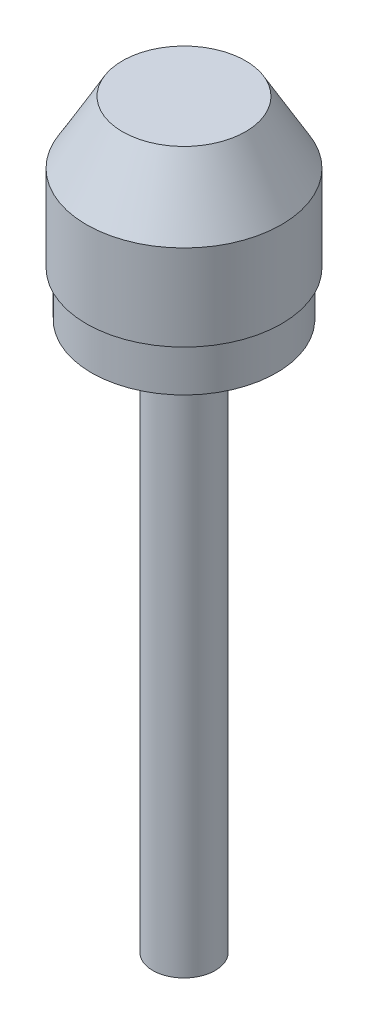
ISO-10303-21;
HEADER;
FILE_DESCRIPTION(('STEP AP214'),'2;1');
FILE_NAME('part.step','',(''),(''),'','','');
FILE_SCHEMA(('AUTOMOTIVE_DESIGN { 1 0 10303 214 1 1 1 1 }'));
ENDSEC;
DATA;
#1=APPLICATION_CONTEXT('core data for automotive mechanical design processes');
#2=APPLICATION_PROTOCOL_DEFINITION('international standard','automotive_design',2000,#1);
#3=PRODUCT_CONTEXT('',#1,'mechanical');
#4=PRODUCT('Part','Part','',(#3));
#5=PRODUCT_RELATED_PRODUCT_CATEGORY('part','',(#4));
#6=PRODUCT_DEFINITION_FORMATION('','',#4);
#7=PRODUCT_DEFINITION_CONTEXT('part definition',#1,'design');
#8=PRODUCT_DEFINITION('design','',#6,#7);
#9=PRODUCT_DEFINITION_SHAPE('','',#8);
#10=(LENGTH_UNIT() NAMED_UNIT(*) SI_UNIT(.MILLI.,.METRE.));
#11=(NAMED_UNIT(*) PLANE_ANGLE_UNIT() SI_UNIT($,.RADIAN.));
#12=(NAMED_UNIT(*) SI_UNIT($,.STERADIAN.) SOLID_ANGLE_UNIT());
#13=UNCERTAINTY_MEASURE_WITH_UNIT(LENGTH_MEASURE(1.E-05),#10,'distance_accuracy_value','');
#14=(GEOMETRIC_REPRESENTATION_CONTEXT(3) GLOBAL_UNCERTAINTY_ASSIGNED_CONTEXT((#13)) GLOBAL_UNIT_ASSIGNED_CONTEXT((#10,
#11,#12)) REPRESENTATION_CONTEXT('',''));
#15=CARTESIAN_POINT('',(0.,0.,0.));
#16=DIRECTION('',(0.,0.,1.));
#17=DIRECTION('',(1.,0.,0.));
#18=AXIS2_PLACEMENT_3D('',#15,#16,#17);
#19=CARTESIAN_POINT('',(0.,35.,0.));
#20=DIRECTION('',(0.,-1.,0.));
#21=DIRECTION('',(0.,0.,-1.));
#22=AXIS2_PLACEMENT_3D('',#19,#20,#21);
#23=CYLINDRICAL_SURFACE('',#22,2.);
#24=CARTESIAN_POINT('',(0.,35.,0.));
#25=DIRECTION('',(0.,1.,0.));
#26=DIRECTION('',(0.,0.,1.));
#27=AXIS2_PLACEMENT_3D('',#24,#25,#26);
#28=CIRCLE('',#27,2.);
#29=CARTESIAN_POINT('',(0.,35.,2.));
#30=VERTEX_POINT('',#29);
#31=EDGE_CURVE('E55',#30,#30,#28,.T.);
#32=ORIENTED_EDGE('',*,*,#31,.F.);
#33=EDGE_LOOP('',(#32));
#34=FACE_BOUND('',#33,.T.);
#35=CARTESIAN_POINT('',(0.,0.,0.));
#36=DIRECTION('',(0.,1.,0.));
#37=DIRECTION('',(0.,0.,1.));
#38=AXIS2_PLACEMENT_3D('',#35,#36,#37);
#39=CIRCLE('',#38,2.);
#40=CARTESIAN_POINT('',(0.,0.,2.));
#41=VERTEX_POINT('',#40);
#42=EDGE_CURVE('E56',#41,#41,#39,.T.);
#43=ORIENTED_EDGE('',*,*,#42,.T.);
#44=EDGE_LOOP('',(#43));
#45=FACE_BOUND('',#44,.T.);
#46=ADVANCED_FACE('F35',(#34,#45),#23,.T.);
#47=CARTESIAN_POINT('',(0.,0.,0.));
#48=DIRECTION('',(0.,1.,0.));
#49=DIRECTION('',(0.,0.,1.));
#50=AXIS2_PLACEMENT_3D('',#47,#48,#49);
#51=PLANE('',#50);
#52=ORIENTED_EDGE('',*,*,#42,.F.);
#53=EDGE_LOOP('',(#52));
#54=FACE_BOUND('',#53,.T.);
#55=ADVANCED_FACE('F85',(#54),#51,.F.);
#56=CARTESIAN_POINT('',(0.,38.,0.));
#57=DIRECTION('',(0.,-1.,0.));
#58=DIRECTION('',(0.,0.,-1.));
#59=AXIS2_PLACEMENT_3D('',#56,#57,#58);
#60=CYLINDRICAL_SURFACE('',#59,5.925);
#61=CARTESIAN_POINT('',(0.,35.1154700538379,0.));
#62=DIRECTION('',(0.,1.,0.));
#63=DIRECTION('',(0.,0.,1.));
#64=AXIS2_PLACEMENT_3D('',#61,#62,#63);
#65=CIRCLE('',#64,5.925);
#66=CARTESIAN_POINT('',(0.,35.1154700538379,5.925));
#67=VERTEX_POINT('',#66);
#68=EDGE_CURVE('E42',#67,#67,#65,.T.);
#69=ORIENTED_EDGE('',*,*,#68,.T.);
#70=EDGE_LOOP('',(#69));
#71=FACE_BOUND('',#70,.T.);
#72=CARTESIAN_POINT('',(0.,38.,0.));
#73=DIRECTION('',(0.,1.,0.));
#74=DIRECTION('',(0.,0.,1.));
#75=AXIS2_PLACEMENT_3D('',#72,#73,#74);
#76=CIRCLE('',#75,5.925);
#77=CARTESIAN_POINT('',(0.,38.,5.925));
#78=VERTEX_POINT('',#77);
#79=EDGE_CURVE('E59',#78,#78,#76,.T.);
#80=ORIENTED_EDGE('',*,*,#79,.F.);
#81=EDGE_LOOP('',(#80));
#82=FACE_BOUND('',#81,.T.);
#83=ADVANCED_FACE('F91',(#71,#82),#60,.T.);
#84=CARTESIAN_POINT('',(0.,35.,0.));
#85=DIRECTION('',(0.,1.,0.));
#86=DIRECTION('',(0.,0.,1.));
#87=AXIS2_PLACEMENT_3D('',#84,#85,#86);
#88=PLANE('',#87);
#89=CARTESIAN_POINT('',(0.,35.,0.));
#90=DIRECTION('',(0.,1.,0.));
#91=DIRECTION('',(0.,0.,1.));
#92=AXIS2_PLACEMENT_3D('',#89,#90,#91);
#93=CIRCLE('',#92,5.725);
#94=CARTESIAN_POINT('',(0.,35.,5.725));
#95=VERTEX_POINT('',#94);
#96=EDGE_CURVE('E10',#95,#95,#93,.F.);
#97=ORIENTED_EDGE('',*,*,#96,.T.);
#98=EDGE_LOOP('',(#97));
#99=FACE_BOUND('',#98,.T.);
#100=ORIENTED_EDGE('',*,*,#31,.T.);
#101=EDGE_LOOP('',(#100));
#102=FACE_BOUND('',#101,.T.);
#103=ADVANCED_FACE('F99',(#99,#102),#88,.F.);
#104=CARTESIAN_POINT('',(0.,47.5,0.));
#105=DIRECTION('',(0.,-1.,0.));
#106=DIRECTION('',(0.,0.,-1.));
#107=AXIS2_PLACEMENT_3D('',#104,#105,#106);
#108=CYLINDRICAL_SURFACE('',#107,6.25);
#109=CARTESIAN_POINT('',(0.,43.5,0.));
#110=DIRECTION('',(0.,1.,0.));
#111=DIRECTION('',(0.,0.,1.));
#112=AXIS2_PLACEMENT_3D('',#109,#110,#111);
#113=CIRCLE('',#112,6.25);
#114=CARTESIAN_POINT('',(0.,43.5,6.25));
#115=VERTEX_POINT('',#114);
#116=EDGE_CURVE('E46',#115,#115,#113,.F.);
#117=ORIENTED_EDGE('',*,*,#116,.T.);
#118=EDGE_LOOP('',(#117));
#119=FACE_BOUND('',#118,.T.);
#120=CARTESIAN_POINT('',(0.,38.,0.));
#121=DIRECTION('',(0.,1.,0.));
#122=DIRECTION('',(0.,0.,1.));
#123=AXIS2_PLACEMENT_3D('',#120,#121,#122);
#124=CIRCLE('',#123,6.25);
#125=CARTESIAN_POINT('',(0.,38.,6.25));
#126=VERTEX_POINT('',#125);
#127=EDGE_CURVE('E64',#126,#126,#124,.T.);
#128=ORIENTED_EDGE('',*,*,#127,.T.);
#129=EDGE_LOOP('',(#128));
#130=FACE_BOUND('',#129,.T.);
#131=ADVANCED_FACE('F68',(#119,#130),#108,.T.);
#132=CARTESIAN_POINT('',(0.,47.5,0.));
#133=DIRECTION('',(0.,1.,0.));
#134=DIRECTION('',(0.,0.,1.));
#135=AXIS2_PLACEMENT_3D('',#132,#133,#134);
#136=PLANE('',#135);
#137=CARTESIAN_POINT('',(0.,47.5,0.));
#138=DIRECTION('',(0.,1.,0.));
#139=DIRECTION('',(0.,0.,1.));
#140=AXIS2_PLACEMENT_3D('',#137,#138,#139);
#141=CIRCLE('',#140,3.94059892324149);
#142=CARTESIAN_POINT('',(0.,47.5,3.94059892324149));
#143=VERTEX_POINT('',#142);
#144=EDGE_CURVE('E50',#143,#143,#141,.T.);
#145=ORIENTED_EDGE('',*,*,#144,.T.);
#146=EDGE_LOOP('',(#145));
#147=FACE_BOUND('',#146,.T.);
#148=ADVANCED_FACE('F73',(#147),#136,.T.);
#149=CARTESIAN_POINT('',(0.,38.,0.));
#150=DIRECTION('',(0.,1.,0.));
#151=DIRECTION('',(0.,0.,1.));
#152=AXIS2_PLACEMENT_3D('',#149,#150,#151);
#153=PLANE('',#152);
#154=ORIENTED_EDGE('',*,*,#79,.T.);
#155=EDGE_LOOP('',(#154));
#156=FACE_BOUND('',#155,.T.);
#157=ORIENTED_EDGE('',*,*,#127,.F.);
#158=EDGE_LOOP('',(#157));
#159=FACE_BOUND('',#158,.T.);
#160=ADVANCED_FACE('F70',(#156,#159),#153,.F.);
#161=CARTESIAN_POINT('',(0.,47.5,0.));
#162=DIRECTION('',(0.,-1.,0.));
#163=DIRECTION('',(0.,0.,-1.));
#164=AXIS2_PLACEMENT_3D('',#161,#162,#163);
#165=CONICAL_SURFACE('',#164,3.94059892324149,0.523598775598296);
#166=ORIENTED_EDGE('',*,*,#116,.F.);
#167=EDGE_LOOP('',(#166));
#168=FACE_BOUND('',#167,.T.);
#169=ORIENTED_EDGE('',*,*,#144,.F.);
#170=EDGE_LOOP('',(#169));
#171=FACE_BOUND('',#170,.T.);
#172=ADVANCED_FACE('F72',(#168,#171),#165,.T.);
#173=CARTESIAN_POINT('',(0.,35.1154700538379,0.));
#174=DIRECTION('',(0.,1.,0.));
#175=DIRECTION('',(0.,0.,1.));
#176=AXIS2_PLACEMENT_3D('',#173,#174,#175);
#177=CONICAL_SURFACE('',#176,5.925,1.04719755119659);
#178=ORIENTED_EDGE('',*,*,#96,.F.);
#179=EDGE_LOOP('',(#178));
#180=FACE_BOUND('',#179,.T.);
#181=ORIENTED_EDGE('',*,*,#68,.F.);
#182=EDGE_LOOP('',(#181));
#183=FACE_BOUND('',#182,.T.);
#184=ADVANCED_FACE('F37',(#180,#183),#177,.T.);
#185=CLOSED_SHELL('',(#46,#55,#83,#103,#131,#148,#160,#172,#184));
#186=MANIFOLD_SOLID_BREP('B2',#185);
#187=ADVANCED_BREP_SHAPE_REPRESENTATION('',(#18,#186),#14);
#188=SHAPE_DEFINITION_REPRESENTATION(#9,#187);
ENDSEC;
END-ISO-10303-21;
